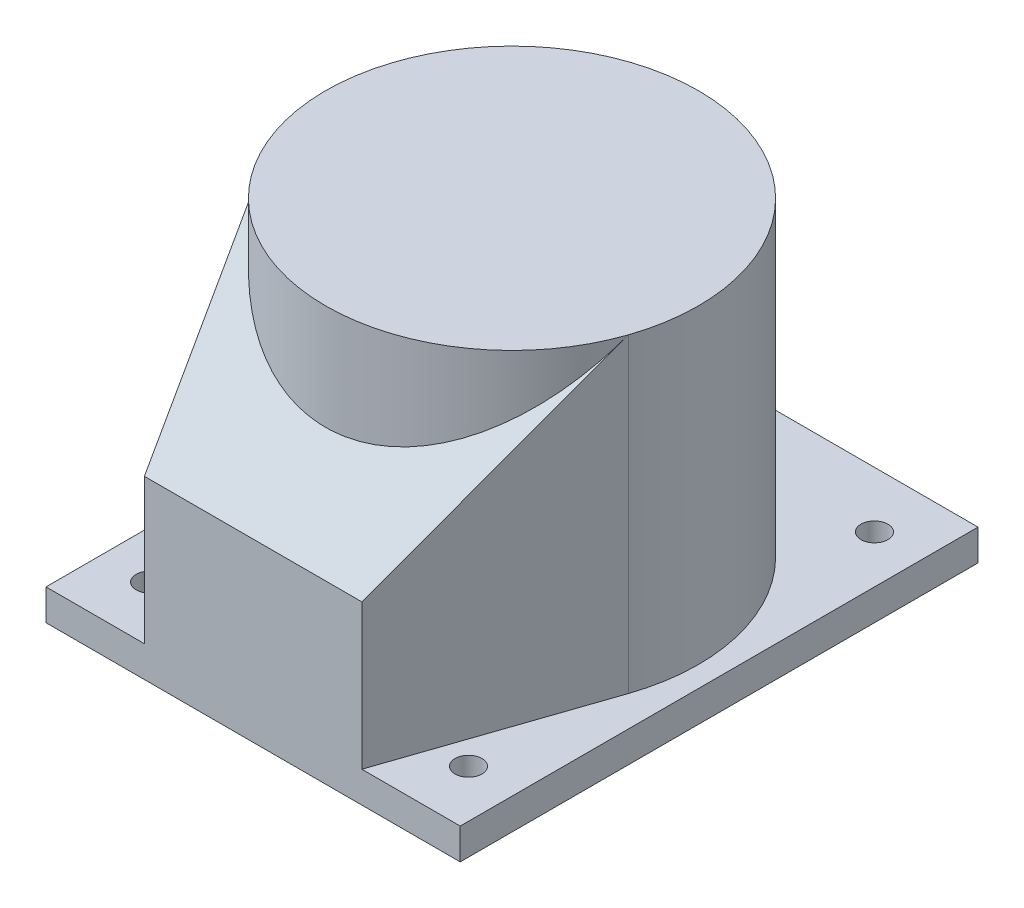
ISO-10303-21;
HEADER;
FILE_DESCRIPTION(('STEP AP214'),'2;1');
FILE_NAME('part.step','',(''),(''),'','','');
FILE_SCHEMA(('AUTOMOTIVE_DESIGN { 1 0 10303 214 1 1 1 1 }'));
ENDSEC;
DATA;
#1=APPLICATION_CONTEXT('core data for automotive mechanical design processes');
#2=APPLICATION_PROTOCOL_DEFINITION('international standard','automotive_design',2000,#1);
#3=PRODUCT_CONTEXT('',#1,'mechanical');
#4=PRODUCT('Part','Part','',(#3));
#5=PRODUCT_RELATED_PRODUCT_CATEGORY('part','',(#4));
#6=PRODUCT_DEFINITION_FORMATION('','',#4);
#7=PRODUCT_DEFINITION_CONTEXT('part definition',#1,'design');
#8=PRODUCT_DEFINITION('design','',#6,#7);
#9=PRODUCT_DEFINITION_SHAPE('','',#8);
#10=(LENGTH_UNIT() NAMED_UNIT(*) SI_UNIT(.MILLI.,.METRE.));
#11=(NAMED_UNIT(*) PLANE_ANGLE_UNIT() SI_UNIT($,.RADIAN.));
#12=(NAMED_UNIT(*) SI_UNIT($,.STERADIAN.) SOLID_ANGLE_UNIT());
#13=UNCERTAINTY_MEASURE_WITH_UNIT(LENGTH_MEASURE(1.E-05),#10,'distance_accuracy_value','');
#14=(GEOMETRIC_REPRESENTATION_CONTEXT(3) GLOBAL_UNCERTAINTY_ASSIGNED_CONTEXT((#13)) GLOBAL_UNIT_ASSIGNED_CONTEXT((#10,
#11,#12)) REPRESENTATION_CONTEXT('',''));
#15=CARTESIAN_POINT('',(0.,0.,0.));
#16=DIRECTION('',(0.,0.,1.));
#17=DIRECTION('',(1.,0.,0.));
#18=AXIS2_PLACEMENT_3D('',#15,#16,#17);
#19=CARTESIAN_POINT('',(99.9999999999996,15.,125.));
#20=DIRECTION('',(0.,0.,-1.));
#21=DIRECTION('',(-1.,0.,0.));
#22=AXIS2_PLACEMENT_3D('',#19,#20,#21);
#23=PLANE('',#22);
#24=DIRECTION('',(1.,0.,0.));
#25=VECTOR('',#24,1.);
#26=CARTESIAN_POINT('',(-515.841961586301,85.,124.999999999998));
#27=LINE('',#26,#25);
#28=CARTESIAN_POINT('',(-52.5000000000006,85.,125.));
#29=VERTEX_POINT('',#28);
#30=CARTESIAN_POINT('',(52.4999999999994,85.,125.));
#31=VERTEX_POINT('',#30);
#32=EDGE_CURVE('E107',#29,#31,#27,.T.);
#33=ORIENTED_EDGE('',*,*,#32,.F.);
#34=DIRECTION('',(0.,-1.,0.));
#35=VECTOR('',#34,1.);
#36=CARTESIAN_POINT('',(-52.5000000000004,165.,125.));
#37=LINE('',#36,#35);
#38=CARTESIAN_POINT('',(-52.5000000000004,15.,125.));
#39=VERTEX_POINT('',#38);
#40=EDGE_CURVE('E123',#29,#39,#37,.T.);
#41=ORIENTED_EDGE('',*,*,#40,.T.);
#42=DIRECTION('',(1.,0.,0.));
#43=VECTOR('',#42,1.);
#44=CARTESIAN_POINT('',(99.9999999999996,15.,125.));
#45=LINE('',#44,#43);
#46=CARTESIAN_POINT('',(-100.,15.,125.));
#47=VERTEX_POINT('',#46);
#48=EDGE_CURVE('E172',#47,#39,#45,.T.);
#49=ORIENTED_EDGE('',*,*,#48,.F.);
#50=DIRECTION('',(0.,-1.,0.));
#51=VECTOR('',#50,1.);
#52=CARTESIAN_POINT('',(-100.,15.,125.));
#53=LINE('',#52,#51);
#54=CARTESIAN_POINT('',(-100.,0.,125.));
#55=VERTEX_POINT('',#54);
#56=EDGE_CURVE('E41',#47,#55,#53,.T.);
#57=ORIENTED_EDGE('',*,*,#56,.T.);
#58=DIRECTION('',(1.,0.,0.));
#59=VECTOR('',#58,1.);
#60=CARTESIAN_POINT('',(99.9999999999996,0.,125.));
#61=LINE('',#60,#59);
#62=CARTESIAN_POINT('',(99.9999999999996,0.,125.));
#63=VERTEX_POINT('',#62);
#64=EDGE_CURVE('E181',#55,#63,#61,.T.);
#65=ORIENTED_EDGE('',*,*,#64,.T.);
#66=DIRECTION('',(0.,-1.,0.));
#67=VECTOR('',#66,1.);
#68=CARTESIAN_POINT('',(99.9999999999996,15.,125.));
#69=LINE('',#68,#67);
#70=CARTESIAN_POINT('',(99.9999999999996,15.,125.));
#71=VERTEX_POINT('',#70);
#72=EDGE_CURVE('E186',#71,#63,#69,.T.);
#73=ORIENTED_EDGE('',*,*,#72,.F.);
#74=CARTESIAN_POINT('',(52.4999999999996,15.,125.));
#75=VERTEX_POINT('',#74);
#76=EDGE_CURVE('E171',#75,#71,#45,.T.);
#77=ORIENTED_EDGE('',*,*,#76,.F.);
#78=DIRECTION('',(0.,-1.,0.));
#79=VECTOR('',#78,1.);
#80=CARTESIAN_POINT('',(52.4999999999996,165.,125.));
#81=LINE('',#80,#79);
#82=EDGE_CURVE('E56',#31,#75,#81,.T.);
#83=ORIENTED_EDGE('',*,*,#82,.F.);
#84=EDGE_LOOP('',(#33,#41,#49,#57,#65,#73,#77,#83));
#85=FACE_BOUND('',#84,.T.);
#86=ADVANCED_FACE('F33',(#85),#23,.F.);
#87=CARTESIAN_POINT('',(52.4999999999996,165.,125.));
#88=DIRECTION('',(-0.946592988462197,0.,-0.32243094484588));
#89=DIRECTION('',(-0.32243094484588,0.,0.946592988462197));
#90=AXIS2_PLACEMENT_3D('',#87,#88,#89);
#91=PLANE('',#90);
#92=DIRECTION('',(0.253131026430143,0.619406404344494,-0.743142240567341));
#93=VECTOR('',#92,1.);
#94=CARTESIAN_POINT('',(65.0432783127296,115.693143499438,88.175434948294));
#95=LINE('',#94,#93);
#96=CARTESIAN_POINT('',(85.1933689615977,165.,29.0187850361292));
#97=VERTEX_POINT('',#96);
#98=EDGE_CURVE('E114',#31,#97,#95,.T.);
#99=ORIENTED_EDGE('',*,*,#98,.F.);
#100=ORIENTED_EDGE('',*,*,#82,.T.);
#101=DIRECTION('',(0.32243094484588,0.,-0.946592988462197));
#102=VECTOR('',#101,1.);
#103=CARTESIAN_POINT('',(52.4999999999996,15.,125.));
#104=LINE('',#103,#102);
#105=CARTESIAN_POINT('',(85.1933689615977,15.,29.0187850361292));
#106=VERTEX_POINT('',#105);
#107=EDGE_CURVE('E210',#75,#106,#104,.T.);
#108=ORIENTED_EDGE('',*,*,#107,.T.);
#109=DIRECTION('',(0.,-1.,0.));
#110=VECTOR('',#109,1.);
#111=CARTESIAN_POINT('',(85.1933689615977,165.,29.0187850361292));
#112=LINE('',#111,#110);
#113=EDGE_CURVE('E133',#97,#106,#112,.T.);
#114=ORIENTED_EDGE('',*,*,#113,.F.);
#115=EDGE_LOOP('',(#99,#100,#108,#114));
#116=FACE_BOUND('',#115,.T.);
#117=ADVANCED_FACE('F215',(#116),#91,.F.);
#118=CARTESIAN_POINT('',(-52.5000000000004,165.,125.));
#119=DIRECTION('',(-0.946592988462199,0.,0.322430944845874));
#120=DIRECTION('',(0.322430944845874,0.,0.946592988462199));
#121=AXIS2_PLACEMENT_3D('',#118,#119,#120);
#122=PLANE('',#121);
#123=ORIENTED_EDGE('',*,*,#40,.F.);
#124=DIRECTION('',(-0.253131026430137,0.619406404344494,-0.743142240567343));
#125=VECTOR('',#124,1.);
#126=CARTESIAN_POINT('',(-65.0432783127302,115.693143499438,88.1754349482935));
#127=LINE('',#126,#125);
#128=CARTESIAN_POINT('',(-85.1933689615979,165.,29.0187850361286));
#129=VERTEX_POINT('',#128);
#130=EDGE_CURVE('E112',#29,#129,#127,.T.);
#131=ORIENTED_EDGE('',*,*,#130,.T.);
#132=DIRECTION('',(0.,-1.,0.));
#133=VECTOR('',#132,1.);
#134=CARTESIAN_POINT('',(-85.1933689615979,165.,29.0187850361287));
#135=LINE('',#134,#133);
#136=CARTESIAN_POINT('',(-85.1933689615979,15.,29.0187850361287));
#137=VERTEX_POINT('',#136);
#138=EDGE_CURVE('E121',#129,#137,#135,.T.);
#139=ORIENTED_EDGE('',*,*,#138,.T.);
#140=DIRECTION('',(-0.322430944845874,0.,-0.946592988462199));
#141=VECTOR('',#140,1.);
#142=CARTESIAN_POINT('',(-52.5000000000004,15.,125.));
#143=LINE('',#142,#141);
#144=EDGE_CURVE('E48',#39,#137,#143,.T.);
#145=ORIENTED_EDGE('',*,*,#144,.F.);
#146=EDGE_LOOP('',(#123,#131,#139,#145));
#147=FACE_BOUND('',#146,.T.);
#148=ADVANCED_FACE('F119',(#147),#122,.T.);
#149=CARTESIAN_POINT('',(0.,165.,0.));
#150=DIRECTION('',(0.,1.,0.));
#151=DIRECTION('',(-1.,0.,0.));
#152=AXIS2_PLACEMENT_3D('',#149,#150,#151);
#153=PLANE('',#152);
#154=CARTESIAN_POINT('',(0.,165.,0.));
#155=DIRECTION('',(0.,1.,0.));
#156=DIRECTION('',(-1.,0.,0.));
#157=AXIS2_PLACEMENT_3D('',#154,#155,#156);
#158=CIRCLE('',#157,90.);
#159=EDGE_CURVE('E126',#97,#129,#158,.T.);
#160=ORIENTED_EDGE('',*,*,#159,.T.);
#161=CARTESIAN_POINT('',(0.,165.,0.));
#162=DIRECTION('',(0.,1.,0.));
#163=DIRECTION('',(1.,0.,0.));
#164=AXIS2_PLACEMENT_3D('',#161,#162,#163);
#165=CIRCLE('',#164,90.);
#166=EDGE_CURVE('E100',#129,#97,#165,.T.);
#167=ORIENTED_EDGE('',*,*,#166,.T.);
#168=EDGE_LOOP('',(#160,#167));
#169=FACE_BOUND('',#168,.T.);
#170=ADVANCED_FACE('F127',(#169),#153,.T.);
#171=CARTESIAN_POINT('',(0.,15.,0.));
#172=DIRECTION('',(0.,-1.,0.));
#173=DIRECTION('',(1.,0.,0.));
#174=AXIS2_PLACEMENT_3D('',#171,#172,#173);
#175=PLANE('',#174);
#176=ORIENTED_EDGE('',*,*,#48,.T.);
#177=ORIENTED_EDGE('',*,*,#144,.T.);
#178=CARTESIAN_POINT('',(0.,15.,0.));
#179=DIRECTION('',(0.,1.,0.));
#180=DIRECTION('',(-1.,0.,0.));
#181=AXIS2_PLACEMENT_3D('',#178,#179,#180);
#182=CIRCLE('',#181,90.);
#183=EDGE_CURVE('E132',#106,#137,#182,.T.);
#184=ORIENTED_EDGE('',*,*,#183,.F.);
#185=ORIENTED_EDGE('',*,*,#107,.F.);
#186=ORIENTED_EDGE('',*,*,#76,.T.);
#187=DIRECTION('',(0.,0.,-1.));
#188=VECTOR('',#187,1.);
#189=CARTESIAN_POINT('',(99.9999999999996,15.,125.));
#190=LINE('',#189,#188);
#191=CARTESIAN_POINT('',(100.,15.,-125.));
#192=VERTEX_POINT('',#191);
#193=EDGE_CURVE('E174',#71,#192,#190,.T.);
#194=ORIENTED_EDGE('',*,*,#193,.T.);
#195=DIRECTION('',(-1.,0.,0.));
#196=VECTOR('',#195,1.);
#197=CARTESIAN_POINT('',(100.,15.,-125.));
#198=LINE('',#197,#196);
#199=CARTESIAN_POINT('',(-99.9999999999996,15.,-125.));
#200=VERTEX_POINT('',#199);
#201=EDGE_CURVE('E165',#192,#200,#198,.T.);
#202=ORIENTED_EDGE('',*,*,#201,.T.);
#203=DIRECTION('',(0.,0.,1.));
#204=VECTOR('',#203,1.);
#205=CARTESIAN_POINT('',(-100.,15.,125.));
#206=LINE('',#205,#204);
#207=EDGE_CURVE('E168',#200,#47,#206,.T.);
#208=ORIENTED_EDGE('',*,*,#207,.T.);
#209=EDGE_LOOP('',(#176,#177,#184,#185,#186,#194,#202,#208));
#210=FACE_BOUND('',#209,.T.);
#211=CARTESIAN_POINT('',(77.0000000000003,15.,-97.9999999999998));
#212=DIRECTION('',(0.,1.,0.));
#213=DIRECTION('',(-1.,0.,0.));
#214=AXIS2_PLACEMENT_3D('',#211,#212,#213);
#215=CIRCLE('',#214,6.5);
#216=CARTESIAN_POINT('',(70.5000000000003,15.,-97.9999999999998));
#217=VERTEX_POINT('',#216);
#218=EDGE_CURVE('E159',#217,#217,#215,.T.);
#219=ORIENTED_EDGE('',*,*,#218,.F.);
#220=EDGE_LOOP('',(#219));
#221=FACE_BOUND('',#220,.T.);
#222=CARTESIAN_POINT('',(76.9999999999996,15.,98.0000000000003));
#223=DIRECTION('',(0.,1.,0.));
#224=DIRECTION('',(1.,0.,0.));
#225=AXIS2_PLACEMENT_3D('',#222,#223,#224);
#226=CIRCLE('',#225,6.5);
#227=CARTESIAN_POINT('',(83.4999999999996,15.,98.0000000000003));
#228=VERTEX_POINT('',#227);
#229=EDGE_CURVE('E153',#228,#228,#226,.T.);
#230=ORIENTED_EDGE('',*,*,#229,.F.);
#231=EDGE_LOOP('',(#230));
#232=FACE_BOUND('',#231,.T.);
#233=CARTESIAN_POINT('',(-76.9999999999997,15.,-98.0000000000003));
#234=DIRECTION('',(0.,1.,0.));
#235=DIRECTION('',(1.,0.,0.));
#236=AXIS2_PLACEMENT_3D('',#233,#234,#235);
#237=CIRCLE('',#236,6.5);
#238=CARTESIAN_POINT('',(-70.4999999999997,15.,-98.0000000000003));
#239=VERTEX_POINT('',#238);
#240=EDGE_CURVE('E147',#239,#239,#237,.T.);
#241=ORIENTED_EDGE('',*,*,#240,.F.);
#242=EDGE_LOOP('',(#241));
#243=FACE_BOUND('',#242,.T.);
#244=CARTESIAN_POINT('',(-77.0000000000004,15.,97.9999999999998));
#245=DIRECTION('',(0.,1.,0.));
#246=DIRECTION('',(-1.,0.,0.));
#247=AXIS2_PLACEMENT_3D('',#244,#245,#246);
#248=CIRCLE('',#247,6.5);
#249=CARTESIAN_POINT('',(-83.5000000000004,15.,97.9999999999997));
#250=VERTEX_POINT('',#249);
#251=EDGE_CURVE('E141',#250,#250,#248,.T.);
#252=ORIENTED_EDGE('',*,*,#251,.F.);
#253=EDGE_LOOP('',(#252));
#254=FACE_BOUND('',#253,.T.);
#255=ADVANCED_FACE('F207',(#210,#221,#232,#243,#254),#175,.F.);
#256=CARTESIAN_POINT('',(0.,0.,0.));
#257=DIRECTION('',(0.,-1.,0.));
#258=DIRECTION('',(1.,0.,0.));
#259=AXIS2_PLACEMENT_3D('',#256,#257,#258);
#260=PLANE('',#259);
#261=CARTESIAN_POINT('',(-76.9999999999997,0.,-98.0000000000003));
#262=DIRECTION('',(0.,1.,0.));
#263=DIRECTION('',(1.,0.,0.));
#264=AXIS2_PLACEMENT_3D('',#261,#262,#263);
#265=CIRCLE('',#264,6.5);
#266=CARTESIAN_POINT('',(-70.4999999999997,0.,-98.0000000000003));
#267=VERTEX_POINT('',#266);
#268=EDGE_CURVE('E144',#267,#267,#265,.T.);
#269=ORIENTED_EDGE('',*,*,#268,.T.);
#270=EDGE_LOOP('',(#269));
#271=FACE_BOUND('',#270,.T.);
#272=CARTESIAN_POINT('',(77.0000000000003,0.,-97.9999999999998));
#273=DIRECTION('',(0.,1.,0.));
#274=DIRECTION('',(-1.,0.,0.));
#275=AXIS2_PLACEMENT_3D('',#272,#273,#274);
#276=CIRCLE('',#275,6.5);
#277=CARTESIAN_POINT('',(70.5000000000003,0.,-97.9999999999998));
#278=VERTEX_POINT('',#277);
#279=EDGE_CURVE('E156',#278,#278,#276,.T.);
#280=ORIENTED_EDGE('',*,*,#279,.T.);
#281=EDGE_LOOP('',(#280));
#282=FACE_BOUND('',#281,.T.);
#283=DIRECTION('',(-1.,0.,0.));
#284=VECTOR('',#283,1.);
#285=CARTESIAN_POINT('',(100.,0.,-125.));
#286=LINE('',#285,#284);
#287=CARTESIAN_POINT('',(100.,0.,-125.));
#288=VERTEX_POINT('',#287);
#289=CARTESIAN_POINT('',(-99.9999999999996,0.,-125.));
#290=VERTEX_POINT('',#289);
#291=EDGE_CURVE('E162',#288,#290,#286,.T.);
#292=ORIENTED_EDGE('',*,*,#291,.F.);
#293=DIRECTION('',(0.,0.,-1.));
#294=VECTOR('',#293,1.);
#295=CARTESIAN_POINT('',(99.9999999999996,0.,125.));
#296=LINE('',#295,#294);
#297=EDGE_CURVE('E169',#63,#288,#296,.T.);
#298=ORIENTED_EDGE('',*,*,#297,.F.);
#299=ORIENTED_EDGE('',*,*,#64,.F.);
#300=DIRECTION('',(0.,0.,1.));
#301=VECTOR('',#300,1.);
#302=CARTESIAN_POINT('',(-100.,0.,125.));
#303=LINE('',#302,#301);
#304=EDGE_CURVE('E179',#290,#55,#303,.T.);
#305=ORIENTED_EDGE('',*,*,#304,.F.);
#306=EDGE_LOOP('',(#292,#298,#299,#305));
#307=FACE_BOUND('',#306,.T.);
#308=CARTESIAN_POINT('',(76.9999999999996,0.,98.0000000000003));
#309=DIRECTION('',(0.,1.,0.));
#310=DIRECTION('',(1.,0.,0.));
#311=AXIS2_PLACEMENT_3D('',#308,#309,#310);
#312=CIRCLE('',#311,6.5);
#313=CARTESIAN_POINT('',(83.4999999999996,0.,98.0000000000003));
#314=VERTEX_POINT('',#313);
#315=EDGE_CURVE('E150',#314,#314,#312,.T.);
#316=ORIENTED_EDGE('',*,*,#315,.T.);
#317=EDGE_LOOP('',(#316));
#318=FACE_BOUND('',#317,.T.);
#319=CARTESIAN_POINT('',(-77.0000000000004,0.,97.9999999999998));
#320=DIRECTION('',(0.,1.,0.));
#321=DIRECTION('',(-1.,0.,0.));
#322=AXIS2_PLACEMENT_3D('',#319,#320,#321);
#323=CIRCLE('',#322,6.5);
#324=CARTESIAN_POINT('',(-83.5000000000004,0.,97.9999999999997));
#325=VERTEX_POINT('',#324);
#326=EDGE_CURVE('E140',#325,#325,#323,.T.);
#327=ORIENTED_EDGE('',*,*,#326,.T.);
#328=EDGE_LOOP('',(#327));
#329=FACE_BOUND('',#328,.T.);
#330=ADVANCED_FACE('F198',(#271,#282,#307,#318,#329),#260,.T.);
#331=CARTESIAN_POINT('',(100.,15.,-125.));
#332=DIRECTION('',(0.,0.,1.));
#333=DIRECTION('',(1.,0.,0.));
#334=AXIS2_PLACEMENT_3D('',#331,#332,#333);
#335=PLANE('',#334);
#336=ORIENTED_EDGE('',*,*,#291,.T.);
#337=DIRECTION('',(0.,-1.,0.));
#338=VECTOR('',#337,1.);
#339=CARTESIAN_POINT('',(-99.9999999999996,15.,-125.));
#340=LINE('',#339,#338);
#341=EDGE_CURVE('E11',#200,#290,#340,.T.);
#342=ORIENTED_EDGE('',*,*,#341,.F.);
#343=ORIENTED_EDGE('',*,*,#201,.F.);
#344=DIRECTION('',(0.,-1.,0.));
#345=VECTOR('',#344,1.);
#346=CARTESIAN_POINT('',(100.,15.,-125.));
#347=LINE('',#346,#345);
#348=EDGE_CURVE('E176',#192,#288,#347,.T.);
#349=ORIENTED_EDGE('',*,*,#348,.T.);
#350=EDGE_LOOP('',(#336,#342,#343,#349));
#351=FACE_BOUND('',#350,.T.);
#352=ADVANCED_FACE('F35',(#351),#335,.F.);
#353=CARTESIAN_POINT('',(-100.,15.,125.));
#354=DIRECTION('',(1.,0.,0.));
#355=DIRECTION('',(0.,0.,-1.));
#356=AXIS2_PLACEMENT_3D('',#353,#354,#355);
#357=PLANE('',#356);
#358=ORIENTED_EDGE('',*,*,#304,.T.);
#359=ORIENTED_EDGE('',*,*,#56,.F.);
#360=ORIENTED_EDGE('',*,*,#207,.F.);
#361=ORIENTED_EDGE('',*,*,#341,.T.);
#362=EDGE_LOOP('',(#358,#359,#360,#361));
#363=FACE_BOUND('',#362,.T.);
#364=ADVANCED_FACE('F248',(#363),#357,.F.);
#365=CARTESIAN_POINT('',(99.9999999999996,15.,125.));
#366=DIRECTION('',(-1.,0.,0.));
#367=DIRECTION('',(0.,0.,1.));
#368=AXIS2_PLACEMENT_3D('',#365,#366,#367);
#369=PLANE('',#368);
#370=ORIENTED_EDGE('',*,*,#297,.T.);
#371=ORIENTED_EDGE('',*,*,#348,.F.);
#372=ORIENTED_EDGE('',*,*,#193,.F.);
#373=ORIENTED_EDGE('',*,*,#72,.T.);
#374=EDGE_LOOP('',(#370,#371,#372,#373));
#375=FACE_BOUND('',#374,.T.);
#376=ADVANCED_FACE('F202',(#375),#369,.F.);
#377=CARTESIAN_POINT('',(77.0000000000003,15.,-97.9999999999998));
#378=DIRECTION('',(0.,-1.,0.));
#379=DIRECTION('',(1.,0.,0.));
#380=AXIS2_PLACEMENT_3D('',#377,#378,#379);
#381=CYLINDRICAL_SURFACE('',#380,6.5);
#382=ORIENTED_EDGE('',*,*,#218,.T.);
#383=EDGE_LOOP('',(#382));
#384=FACE_BOUND('',#383,.T.);
#385=ORIENTED_EDGE('',*,*,#279,.F.);
#386=EDGE_LOOP('',(#385));
#387=FACE_BOUND('',#386,.T.);
#388=ADVANCED_FACE('F237',(#384,#387),#381,.F.);
#389=CARTESIAN_POINT('',(76.9999999999996,15.,98.0000000000003));
#390=DIRECTION('',(0.,-1.,0.));
#391=DIRECTION('',(1.,0.,0.));
#392=AXIS2_PLACEMENT_3D('',#389,#390,#391);
#393=CYLINDRICAL_SURFACE('',#392,6.5);
#394=ORIENTED_EDGE('',*,*,#229,.T.);
#395=EDGE_LOOP('',(#394));
#396=FACE_BOUND('',#395,.T.);
#397=ORIENTED_EDGE('',*,*,#315,.F.);
#398=EDGE_LOOP('',(#397));
#399=FACE_BOUND('',#398,.T.);
#400=ADVANCED_FACE('F233',(#396,#399),#393,.F.);
#401=CARTESIAN_POINT('',(-76.9999999999997,15.,-98.0000000000003));
#402=DIRECTION('',(0.,-1.,0.));
#403=DIRECTION('',(1.,0.,0.));
#404=AXIS2_PLACEMENT_3D('',#401,#402,#403);
#405=CYLINDRICAL_SURFACE('',#404,6.5);
#406=ORIENTED_EDGE('',*,*,#240,.T.);
#407=EDGE_LOOP('',(#406));
#408=FACE_BOUND('',#407,.T.);
#409=ORIENTED_EDGE('',*,*,#268,.F.);
#410=EDGE_LOOP('',(#409));
#411=FACE_BOUND('',#410,.T.);
#412=ADVANCED_FACE('F229',(#408,#411),#405,.F.);
#413=CARTESIAN_POINT('',(-77.0000000000004,15.,97.9999999999998));
#414=DIRECTION('',(0.,-1.,0.));
#415=DIRECTION('',(1.,0.,0.));
#416=AXIS2_PLACEMENT_3D('',#413,#414,#415);
#417=CYLINDRICAL_SURFACE('',#416,6.5);
#418=ORIENTED_EDGE('',*,*,#251,.T.);
#419=EDGE_LOOP('',(#418));
#420=FACE_BOUND('',#419,.T.);
#421=ORIENTED_EDGE('',*,*,#326,.F.);
#422=EDGE_LOOP('',(#421));
#423=FACE_BOUND('',#422,.T.);
#424=ADVANCED_FACE('F226',(#420,#423),#417,.F.);
#425=CARTESIAN_POINT('',(0.,165.,0.));
#426=DIRECTION('',(0.,-1.,0.));
#427=DIRECTION('',(1.,0.,0.));
#428=AXIS2_PLACEMENT_3D('',#425,#426,#427);
#429=CYLINDRICAL_SURFACE('',#428,90.);
#430=ORIENTED_EDGE('',*,*,#183,.T.);
#431=ORIENTED_EDGE('',*,*,#138,.F.);
#432=ORIENTED_EDGE('',*,*,#159,.F.);
#433=ORIENTED_EDGE('',*,*,#113,.T.);
#434=EDGE_LOOP('',(#430,#431,#432,#433));
#435=FACE_BOUND('',#434,.T.);
#436=ADVANCED_FACE('F131',(#435),#429,.T.);
#437=CARTESIAN_POINT('',(-515.8419615863,165.,29.0187850361272));
#438=DIRECTION('',(0.,0.768159660896053,0.640258334871215));
#439=DIRECTION('',(0.,0.640258334871215,-0.768159660896053));
#440=AXIS2_PLACEMENT_3D('',#437,#438,#439);
#441=PLANE('',#440);
#442=CARTESIAN_POINT('',(0.,189.187053724709,0.));
#443=DIRECTION('',(0.,0.768159660896053,0.640258334871215));
#444=DIRECTION('',(0.,0.640258334871215,-0.768159660896053));
#445=AXIS2_PLACEMENT_3D('',#442,#443,#444);
#446=ELLIPSE('',#445,117.16314274433,90.);
#447=EDGE_CURVE('E103',#97,#129,#446,.F.);
#448=ORIENTED_EDGE('',*,*,#447,.T.);
#449=ORIENTED_EDGE('',*,*,#130,.F.);
#450=ORIENTED_EDGE('',*,*,#32,.T.);
#451=ORIENTED_EDGE('',*,*,#98,.T.);
#452=EDGE_LOOP('',(#448,#449,#450,#451));
#453=FACE_BOUND('',#452,.T.);
#454=ADVANCED_FACE('F111',(#453),#441,.T.);
#455=CARTESIAN_POINT('',(0.,-500000.,0.));
#456=DIRECTION('',(0.,1.,0.));
#457=DIRECTION('',(-1.,0.,0.));
#458=AXIS2_PLACEMENT_3D('',#455,#456,#457);
#459=CYLINDRICAL_SURFACE('',#458,90.);
#460=ORIENTED_EDGE('',*,*,#447,.F.);
#461=ORIENTED_EDGE('',*,*,#166,.F.);
#462=EDGE_LOOP('',(#460,#461));
#463=FACE_BOUND('',#462,.T.);
#464=ADVANCED_FACE('F102',(#463),#459,.T.);
#465=CLOSED_SHELL('',(#86,#117,#148,#170,#255,#330,#352,#364,#376,#388,#400,#412,#424,#436,#454,#464));
#466=MANIFOLD_SOLID_BREP('B2',#465);
#467=ADVANCED_BREP_SHAPE_REPRESENTATION('',(#18,#466),#14);
#468=SHAPE_DEFINITION_REPRESENTATION(#9,#467);
ENDSEC;
END-ISO-10303-21;
